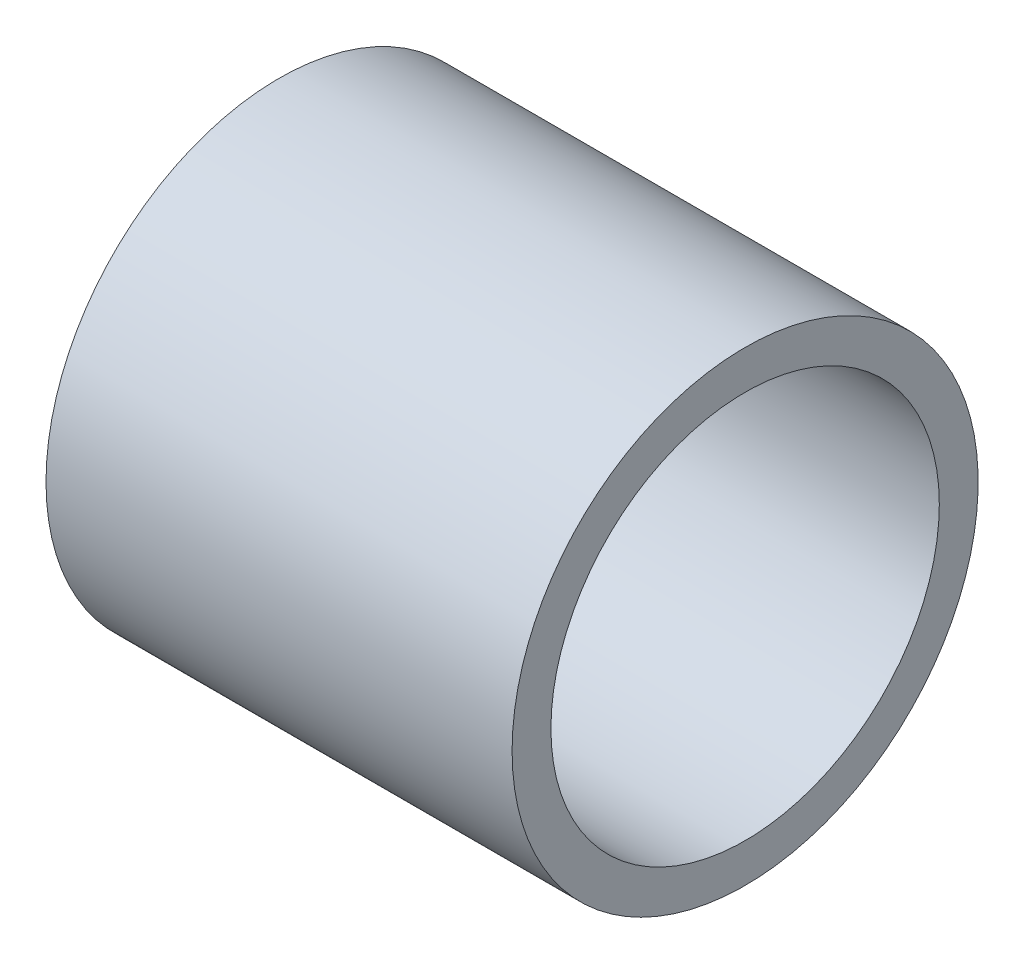
ISO-10303-21;
HEADER;
FILE_DESCRIPTION(('STEP AP214'),'2;1');
FILE_NAME('part.step','',(''),(''),'','','');
FILE_SCHEMA(('AUTOMOTIVE_DESIGN { 1 0 10303 214 1 1 1 1 }'));
ENDSEC;
DATA;
#1=APPLICATION_CONTEXT('core data for automotive mechanical design processes');
#2=APPLICATION_PROTOCOL_DEFINITION('international standard','automotive_design',2000,#1);
#3=PRODUCT_CONTEXT('',#1,'mechanical');
#4=PRODUCT('Part','Part','',(#3));
#5=PRODUCT_RELATED_PRODUCT_CATEGORY('part','',(#4));
#6=PRODUCT_DEFINITION_FORMATION('','',#4);
#7=PRODUCT_DEFINITION_CONTEXT('part definition',#1,'design');
#8=PRODUCT_DEFINITION('design','',#6,#7);
#9=PRODUCT_DEFINITION_SHAPE('','',#8);
#10=(LENGTH_UNIT() NAMED_UNIT(*) SI_UNIT(.MILLI.,.METRE.));
#11=(NAMED_UNIT(*) PLANE_ANGLE_UNIT() SI_UNIT($,.RADIAN.));
#12=(NAMED_UNIT(*) SI_UNIT($,.STERADIAN.) SOLID_ANGLE_UNIT());
#13=UNCERTAINTY_MEASURE_WITH_UNIT(LENGTH_MEASURE(1.E-05),#10,'distance_accuracy_value','');
#14=(GEOMETRIC_REPRESENTATION_CONTEXT(3) GLOBAL_UNCERTAINTY_ASSIGNED_CONTEXT((#13)) GLOBAL_UNIT_ASSIGNED_CONTEXT((#10,
#11,#12)) REPRESENTATION_CONTEXT('',''));
#15=CARTESIAN_POINT('',(0.,0.,0.));
#16=DIRECTION('',(0.,0.,1.));
#17=DIRECTION('',(1.,0.,0.));
#18=AXIS2_PLACEMENT_3D('',#15,#16,#17);
#19=CARTESIAN_POINT('',(3.81,0.,0.));
#20=DIRECTION('',(1.,0.,0.));
#21=DIRECTION('',(0.,0.,-1.));
#22=AXIS2_PLACEMENT_3D('',#19,#20,#21);
#23=PLANE('',#22);
#24=CARTESIAN_POINT('',(3.81,0.,0.));
#25=DIRECTION('',(1.,0.,0.));
#26=DIRECTION('',(0.,0.,-1.));
#27=AXIS2_PLACEMENT_3D('',#24,#25,#26);
#28=CIRCLE('',#27,1.905);
#29=CARTESIAN_POINT('',(3.81,0.,1.905));
#30=VERTEX_POINT('',#29);
#31=EDGE_CURVE('E10',#30,#30,#28,.T.);
#32=ORIENTED_EDGE('',*,*,#31,.T.);
#33=EDGE_LOOP('',(#32));
#34=FACE_BOUND('',#33,.T.);
#35=CARTESIAN_POINT('',(3.81,0.,0.));
#36=DIRECTION('',(1.,0.,0.));
#37=DIRECTION('',(0.,0.,-1.));
#38=AXIS2_PLACEMENT_3D('',#35,#36,#37);
#39=CIRCLE('',#38,1.5875);
#40=CARTESIAN_POINT('',(3.81,0.,1.5875));
#41=VERTEX_POINT('',#40);
#42=EDGE_CURVE('E41',#41,#41,#39,.T.);
#43=ORIENTED_EDGE('',*,*,#42,.F.);
#44=EDGE_LOOP('',(#43));
#45=FACE_BOUND('',#44,.T.);
#46=ADVANCED_FACE('F30',(#34,#45),#23,.T.);
#47=CARTESIAN_POINT('',(0.,0.,0.));
#48=DIRECTION('',(1.,0.,0.));
#49=DIRECTION('',(0.,0.,-1.));
#50=AXIS2_PLACEMENT_3D('',#47,#48,#49);
#51=PLANE('',#50);
#52=CARTESIAN_POINT('',(0.,0.,0.));
#53=DIRECTION('',(1.,0.,0.));
#54=DIRECTION('',(0.,0.,-1.));
#55=AXIS2_PLACEMENT_3D('',#52,#53,#54);
#56=CIRCLE('',#55,1.905);
#57=CARTESIAN_POINT('',(0.,0.,1.905));
#58=VERTEX_POINT('',#57);
#59=EDGE_CURVE('E34',#58,#58,#56,.T.);
#60=ORIENTED_EDGE('',*,*,#59,.F.);
#61=EDGE_LOOP('',(#60));
#62=FACE_BOUND('',#61,.T.);
#63=CARTESIAN_POINT('',(0.,0.,0.));
#64=DIRECTION('',(1.,0.,0.));
#65=DIRECTION('',(0.,0.,-1.));
#66=AXIS2_PLACEMENT_3D('',#63,#64,#65);
#67=CIRCLE('',#66,1.5875);
#68=CARTESIAN_POINT('',(0.,0.,1.5875));
#69=VERTEX_POINT('',#68);
#70=EDGE_CURVE('E43',#69,#69,#67,.T.);
#71=ORIENTED_EDGE('',*,*,#70,.T.);
#72=EDGE_LOOP('',(#71));
#73=FACE_BOUND('',#72,.T.);
#74=ADVANCED_FACE('F53',(#62,#73),#51,.F.);
#75=CARTESIAN_POINT('',(3.81,0.,0.));
#76=DIRECTION('',(-1.,0.,0.));
#77=DIRECTION('',(0.,0.,1.));
#78=AXIS2_PLACEMENT_3D('',#75,#76,#77);
#79=CYLINDRICAL_SURFACE('',#78,1.905);
#80=CARTESIAN_POINT('',(3.81,0.,1.905));
#81=CARTESIAN_POINT('',(3.7703125,0.,1.905));
#82=CARTESIAN_POINT('',(3.730625,0.,1.905));
#83=CARTESIAN_POINT('',(3.65125,0.,1.905));
#84=CARTESIAN_POINT('',(3.6115625,0.,1.905));
#85=CARTESIAN_POINT('',(3.5321875,0.,1.905));
#86=CARTESIAN_POINT('',(3.4925,0.,1.905));
#87=CARTESIAN_POINT('',(3.413125,0.,1.905));
#88=CARTESIAN_POINT('',(3.3734375,0.,1.905));
#89=CARTESIAN_POINT('',(3.2940625,0.,1.905));
#90=CARTESIAN_POINT('',(3.254375,0.,1.905));
#91=CARTESIAN_POINT('',(3.175,0.,1.905));
#92=CARTESIAN_POINT('',(3.1353125,0.,1.905));
#93=CARTESIAN_POINT('',(3.0559375,0.,1.905));
#94=CARTESIAN_POINT('',(3.01625,0.,1.905));
#95=CARTESIAN_POINT('',(2.936875,0.,1.905));
#96=CARTESIAN_POINT('',(2.8971875,0.,1.905));
#97=CARTESIAN_POINT('',(2.8178125,0.,1.905));
#98=CARTESIAN_POINT('',(2.778125,0.,1.905));
#99=CARTESIAN_POINT('',(2.69875,0.,1.905));
#100=CARTESIAN_POINT('',(2.6590625,0.,1.905));
#101=CARTESIAN_POINT('',(2.5796875,0.,1.905));
#102=CARTESIAN_POINT('',(2.54,0.,1.905));
#103=CARTESIAN_POINT('',(2.460625,0.,1.905));
#104=CARTESIAN_POINT('',(2.4209375,0.,1.905));
#105=CARTESIAN_POINT('',(2.3415625,0.,1.905));
#106=CARTESIAN_POINT('',(2.301875,0.,1.905));
#107=CARTESIAN_POINT('',(2.2225,0.,1.905));
#108=CARTESIAN_POINT('',(2.1828125,0.,1.905));
#109=CARTESIAN_POINT('',(2.1034375,0.,1.905));
#110=CARTESIAN_POINT('',(2.06375,0.,1.905));
#111=CARTESIAN_POINT('',(1.984375,0.,1.905));
#112=CARTESIAN_POINT('',(1.9446875,0.,1.905));
#113=CARTESIAN_POINT('',(1.8653125,0.,1.905));
#114=CARTESIAN_POINT('',(1.825625,0.,1.905));
#115=CARTESIAN_POINT('',(1.74625,0.,1.905));
#116=CARTESIAN_POINT('',(1.7065625,0.,1.905));
#117=CARTESIAN_POINT('',(1.6271875,0.,1.905));
#118=CARTESIAN_POINT('',(1.5875,0.,1.905));
#119=CARTESIAN_POINT('',(1.508125,0.,1.905));
#120=CARTESIAN_POINT('',(1.4684375,0.,1.905));
#121=CARTESIAN_POINT('',(1.3890625,0.,1.905));
#122=CARTESIAN_POINT('',(1.349375,0.,1.905));
#123=CARTESIAN_POINT('',(1.27,0.,1.905));
#124=CARTESIAN_POINT('',(1.2303125,0.,1.905));
#125=CARTESIAN_POINT('',(1.1509375,0.,1.905));
#126=CARTESIAN_POINT('',(1.11125,0.,1.905));
#127=CARTESIAN_POINT('',(1.031875,0.,1.905));
#128=CARTESIAN_POINT('',(0.9921875,0.,1.905));
#129=CARTESIAN_POINT('',(0.9128125,0.,1.905));
#130=CARTESIAN_POINT('',(0.873125,0.,1.905));
#131=CARTESIAN_POINT('',(0.79375,0.,1.905));
#132=CARTESIAN_POINT('',(0.7540625,0.,1.905));
#133=CARTESIAN_POINT('',(0.6746875,0.,1.905));
#134=CARTESIAN_POINT('',(0.635,0.,1.905));
#135=CARTESIAN_POINT('',(0.555625,0.,1.905));
#136=CARTESIAN_POINT('',(0.5159375,0.,1.905));
#137=CARTESIAN_POINT('',(0.4365625,0.,1.905));
#138=CARTESIAN_POINT('',(0.396875,0.,1.905));
#139=CARTESIAN_POINT('',(0.3175,0.,1.905));
#140=CARTESIAN_POINT('',(0.2778125,0.,1.905));
#141=CARTESIAN_POINT('',(0.1984375,0.,1.905));
#142=CARTESIAN_POINT('',(0.15875,0.,1.905));
#143=CARTESIAN_POINT('',(0.0793749999999999,0.,1.905));
#144=CARTESIAN_POINT('',(0.0396874999999999,0.,1.905));
#145=CARTESIAN_POINT('',(0.,0.,1.905));
#146=B_SPLINE_CURVE_WITH_KNOTS('',3,(#80,#81,#82,#83,#84,#85,#86,#87,#88,#89,#90,#91,#92,#93,
#94,#95,#96,#97,#98,#99,#100,#101,#102,#103,#104,#105,#106,#107,#108,#109,#110,#111,#112,#113,
#114,#115,#116,#117,#118,#119,#120,#121,#122,#123,#124,#125,#126,#127,#128,#129,#130,#131,#132,
#133,#134,#135,#136,#137,#138,#139,#140,#141,#142,#143,#144,#145),.UNSPECIFIED.,.F.,.F.,(4,2,2,
2,2,2,2,2,2,2,2,2,2,2,2,2,2,2,2,2,2,2,2,2,2,2,2,2,2,2,2,2,4),(0.,0.1190625,0.238125,0.3571875,
0.47625,0.5953125,0.714375,0.8334375,0.9525,1.0715625,1.190625,1.3096875,1.42875,1.5478125,
1.666875,1.7859375,1.905,2.0240625,2.143125,2.2621875,2.38125,2.5003125,2.619375,2.7384375,
2.8575,2.9765625,3.095625,3.2146875,3.33375,3.4528125,3.571875,3.6909375,3.81),.UNSPECIFIED.);
#147=EDGE_CURVE('BSEAM32',#30,#58,#146,.T.);
#148=ORIENTED_EDGE('',*,*,#31,.F.);
#149=ORIENTED_EDGE('',*,*,#59,.T.);
#150=ORIENTED_EDGE('',*,*,#147,.T.);
#151=ORIENTED_EDGE('',*,*,#147,.F.);
#152=EDGE_LOOP('',(#148,#150,#149,#151));
#153=FACE_BOUND('',#152,.T.);
#154=ADVANCED_FACE('F32',(#153),#79,.T.);
#155=CARTESIAN_POINT('',(3.81,0.,0.));
#156=DIRECTION('',(-1.,0.,0.));
#157=DIRECTION('',(0.,0.,1.));
#158=AXIS2_PLACEMENT_3D('',#155,#156,#157);
#159=CYLINDRICAL_SURFACE('',#158,1.5875);
#160=CARTESIAN_POINT('',(3.81,0.,1.5875));
#161=CARTESIAN_POINT('',(3.7703125,0.,1.5875));
#162=CARTESIAN_POINT('',(3.730625,0.,1.5875));
#163=CARTESIAN_POINT('',(3.65125,0.,1.5875));
#164=CARTESIAN_POINT('',(3.6115625,0.,1.5875));
#165=CARTESIAN_POINT('',(3.5321875,0.,1.5875));
#166=CARTESIAN_POINT('',(3.4925,0.,1.5875));
#167=CARTESIAN_POINT('',(3.413125,0.,1.5875));
#168=CARTESIAN_POINT('',(3.3734375,0.,1.5875));
#169=CARTESIAN_POINT('',(3.2940625,0.,1.5875));
#170=CARTESIAN_POINT('',(3.254375,0.,1.5875));
#171=CARTESIAN_POINT('',(3.175,0.,1.5875));
#172=CARTESIAN_POINT('',(3.1353125,0.,1.5875));
#173=CARTESIAN_POINT('',(3.0559375,0.,1.5875));
#174=CARTESIAN_POINT('',(3.01625,0.,1.5875));
#175=CARTESIAN_POINT('',(2.936875,0.,1.5875));
#176=CARTESIAN_POINT('',(2.8971875,0.,1.5875));
#177=CARTESIAN_POINT('',(2.8178125,0.,1.5875));
#178=CARTESIAN_POINT('',(2.778125,0.,1.5875));
#179=CARTESIAN_POINT('',(2.69875,0.,1.5875));
#180=CARTESIAN_POINT('',(2.6590625,0.,1.5875));
#181=CARTESIAN_POINT('',(2.5796875,0.,1.5875));
#182=CARTESIAN_POINT('',(2.54,0.,1.5875));
#183=CARTESIAN_POINT('',(2.460625,0.,1.5875));
#184=CARTESIAN_POINT('',(2.4209375,0.,1.5875));
#185=CARTESIAN_POINT('',(2.3415625,0.,1.5875));
#186=CARTESIAN_POINT('',(2.301875,0.,1.5875));
#187=CARTESIAN_POINT('',(2.2225,0.,1.5875));
#188=CARTESIAN_POINT('',(2.1828125,0.,1.5875));
#189=CARTESIAN_POINT('',(2.1034375,0.,1.5875));
#190=CARTESIAN_POINT('',(2.06375,0.,1.5875));
#191=CARTESIAN_POINT('',(1.984375,0.,1.5875));
#192=CARTESIAN_POINT('',(1.9446875,0.,1.5875));
#193=CARTESIAN_POINT('',(1.8653125,0.,1.5875));
#194=CARTESIAN_POINT('',(1.825625,0.,1.5875));
#195=CARTESIAN_POINT('',(1.74625,0.,1.5875));
#196=CARTESIAN_POINT('',(1.7065625,0.,1.5875));
#197=CARTESIAN_POINT('',(1.6271875,0.,1.5875));
#198=CARTESIAN_POINT('',(1.5875,0.,1.5875));
#199=CARTESIAN_POINT('',(1.508125,0.,1.5875));
#200=CARTESIAN_POINT('',(1.4684375,0.,1.5875));
#201=CARTESIAN_POINT('',(1.3890625,0.,1.5875));
#202=CARTESIAN_POINT('',(1.349375,0.,1.5875));
#203=CARTESIAN_POINT('',(1.27,0.,1.5875));
#204=CARTESIAN_POINT('',(1.2303125,0.,1.5875));
#205=CARTESIAN_POINT('',(1.1509375,0.,1.5875));
#206=CARTESIAN_POINT('',(1.11125,0.,1.5875));
#207=CARTESIAN_POINT('',(1.031875,0.,1.5875));
#208=CARTESIAN_POINT('',(0.9921875,0.,1.5875));
#209=CARTESIAN_POINT('',(0.9128125,0.,1.5875));
#210=CARTESIAN_POINT('',(0.873125,0.,1.5875));
#211=CARTESIAN_POINT('',(0.79375,0.,1.5875));
#212=CARTESIAN_POINT('',(0.7540625,0.,1.5875));
#213=CARTESIAN_POINT('',(0.6746875,0.,1.5875));
#214=CARTESIAN_POINT('',(0.635,0.,1.5875));
#215=CARTESIAN_POINT('',(0.555625,0.,1.5875));
#216=CARTESIAN_POINT('',(0.5159375,0.,1.5875));
#217=CARTESIAN_POINT('',(0.4365625,0.,1.5875));
#218=CARTESIAN_POINT('',(0.396875,0.,1.5875));
#219=CARTESIAN_POINT('',(0.3175,0.,1.5875));
#220=CARTESIAN_POINT('',(0.2778125,0.,1.5875));
#221=CARTESIAN_POINT('',(0.1984375,0.,1.5875));
#222=CARTESIAN_POINT('',(0.15875,0.,1.5875));
#223=CARTESIAN_POINT('',(0.0793749999999999,0.,1.5875));
#224=CARTESIAN_POINT('',(0.0396874999999999,0.,1.5875));
#225=CARTESIAN_POINT('',(0.,0.,1.5875));
#226=B_SPLINE_CURVE_WITH_KNOTS('',3,(#160,#161,#162,#163,#164,#165,#166,#167,#168,#169,#170,
#171,#172,#173,#174,#175,#176,#177,#178,#179,#180,#181,#182,#183,#184,#185,#186,#187,#188,#189,
#190,#191,#192,#193,#194,#195,#196,#197,#198,#199,#200,#201,#202,#203,#204,#205,#206,#207,#208,
#209,#210,#211,#212,#213,#214,#215,#216,#217,#218,#219,#220,#221,#222,#223,#224,#225),
.UNSPECIFIED.,.F.,.F.,(4,2,2,2,2,2,2,2,2,2,2,2,2,2,2,2,2,2,2,2,2,2,2,2,2,2,2,2,2,2,2,2,4),(0.,
0.1190625,0.238125,0.3571875,0.47625,0.5953125,0.714375,0.8334375,0.9525,1.0715625,1.190625,
1.3096875,1.42875,1.5478125,1.666875,1.7859375,1.905,2.0240625,2.143125,2.2621875,2.38125,
2.5003125,2.619375,2.7384375,2.8575,2.9765625,3.095625,3.2146875,3.33375,3.4528125,3.571875,
3.6909375,3.81),.UNSPECIFIED.);
#227=EDGE_CURVE('BSEAM49',#41,#69,#226,.T.);
#228=ORIENTED_EDGE('',*,*,#42,.T.);
#229=ORIENTED_EDGE('',*,*,#70,.F.);
#230=ORIENTED_EDGE('',*,*,#227,.T.);
#231=ORIENTED_EDGE('',*,*,#227,.F.);
#232=EDGE_LOOP('',(#228,#230,#229,#231));
#233=FACE_BOUND('',#232,.T.);
#234=ADVANCED_FACE('F49',(#233),#159,.F.);
#235=CLOSED_SHELL('',(#46,#74,#154,#234));
#236=MANIFOLD_SOLID_BREP('B2',#235);
#237=ADVANCED_BREP_SHAPE_REPRESENTATION('',(#18,#236),#14);
#238=SHAPE_DEFINITION_REPRESENTATION(#9,#237);
ENDSEC;
END-ISO-10303-21;
